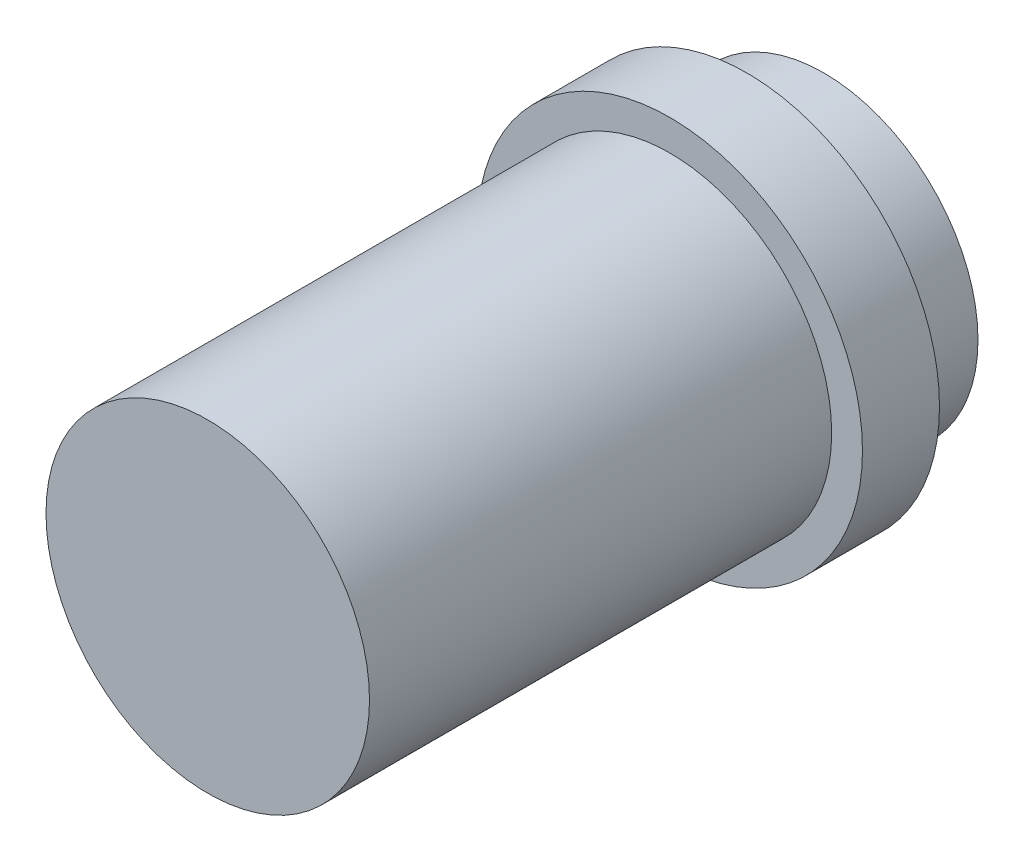
ISO-10303-21;
HEADER;
FILE_DESCRIPTION(('STEP AP214'),'2;1');
FILE_NAME('part.step','',(''),(''),'','','');
FILE_SCHEMA(('AUTOMOTIVE_DESIGN { 1 0 10303 214 1 1 1 1 }'));
ENDSEC;
DATA;
#1=APPLICATION_CONTEXT('core data for automotive mechanical design processes');
#2=APPLICATION_PROTOCOL_DEFINITION('international standard','automotive_design',2000,#1);
#3=PRODUCT_CONTEXT('',#1,'mechanical');
#4=PRODUCT('Part','Part','',(#3));
#5=PRODUCT_RELATED_PRODUCT_CATEGORY('part','',(#4));
#6=PRODUCT_DEFINITION_FORMATION('','',#4);
#7=PRODUCT_DEFINITION_CONTEXT('part definition',#1,'design');
#8=PRODUCT_DEFINITION('design','',#6,#7);
#9=PRODUCT_DEFINITION_SHAPE('','',#8);
#10=(LENGTH_UNIT() NAMED_UNIT(*) SI_UNIT(.MILLI.,.METRE.));
#11=(NAMED_UNIT(*) PLANE_ANGLE_UNIT() SI_UNIT($,.RADIAN.));
#12=(NAMED_UNIT(*) SI_UNIT($,.STERADIAN.) SOLID_ANGLE_UNIT());
#13=UNCERTAINTY_MEASURE_WITH_UNIT(LENGTH_MEASURE(1.E-05),#10,'distance_accuracy_value','');
#14=(GEOMETRIC_REPRESENTATION_CONTEXT(3) GLOBAL_UNCERTAINTY_ASSIGNED_CONTEXT((#13)) GLOBAL_UNIT_ASSIGNED_CONTEXT((#10,
#11,#12)) REPRESENTATION_CONTEXT('',''));
#15=CARTESIAN_POINT('',(0.,0.,0.));
#16=DIRECTION('',(0.,0.,1.));
#17=DIRECTION('',(1.,0.,0.));
#18=AXIS2_PLACEMENT_3D('',#15,#16,#17);
#19=CARTESIAN_POINT('',(0.,0.,1.));
#20=DIRECTION('',(0.,0.,-1.));
#21=DIRECTION('',(-1.,0.,0.));
#22=AXIS2_PLACEMENT_3D('',#19,#20,#21);
#23=CYLINDRICAL_SURFACE('',#22,1.25);
#24=CARTESIAN_POINT('',(0.,0.,-1.));
#25=DIRECTION('',(0.,0.,-1.));
#26=DIRECTION('',(-1.,0.,0.));
#27=AXIS2_PLACEMENT_3D('',#24,#25,#26);
#28=CIRCLE('',#27,1.25);
#29=CARTESIAN_POINT('',(-1.25,0.,-1.));
#30=VERTEX_POINT('',#29);
#31=EDGE_CURVE('E53',#30,#30,#28,.T.);
#32=ORIENTED_EDGE('',*,*,#31,.T.);
#33=EDGE_LOOP('',(#32));
#34=FACE_BOUND('',#33,.T.);
#35=CARTESIAN_POINT('',(0.,0.,6.));
#36=DIRECTION('',(0.,0.,1.));
#37=DIRECTION('',(1.,0.,0.));
#38=AXIS2_PLACEMENT_3D('',#35,#36,#37);
#39=CIRCLE('',#38,1.25);
#40=CARTESIAN_POINT('',(1.25,0.,6.));
#41=VERTEX_POINT('',#40);
#42=EDGE_CURVE('E60',#41,#41,#39,.T.);
#43=ORIENTED_EDGE('',*,*,#42,.T.);
#44=EDGE_LOOP('',(#43));
#45=FACE_BOUND('',#44,.T.);
#46=ADVANCED_FACE('F33',(#34,#45),#23,.F.);
#47=CARTESIAN_POINT('',(0.,0.,1.));
#48=DIRECTION('',(0.,0.,1.));
#49=DIRECTION('',(1.,0.,0.));
#50=AXIS2_PLACEMENT_3D('',#47,#48,#49);
#51=PLANE('',#50);
#52=CARTESIAN_POINT('',(0.,0.,1.));
#53=DIRECTION('',(0.,0.,1.));
#54=DIRECTION('',(1.,0.,0.));
#55=AXIS2_PLACEMENT_3D('',#52,#53,#54);
#56=CIRCLE('',#55,2.5);
#57=CARTESIAN_POINT('',(2.5,0.,1.));
#58=VERTEX_POINT('',#57);
#59=EDGE_CURVE('E40',#58,#58,#56,.T.);
#60=ORIENTED_EDGE('',*,*,#59,.T.);
#61=EDGE_LOOP('',(#60));
#62=FACE_BOUND('',#61,.T.);
#63=CARTESIAN_POINT('',(0.,0.,1.));
#64=DIRECTION('',(0.,0.,1.));
#65=DIRECTION('',(1.,0.,0.));
#66=AXIS2_PLACEMENT_3D('',#63,#64,#65);
#67=CIRCLE('',#66,2.1);
#68=CARTESIAN_POINT('',(2.1,0.,1.));
#69=VERTEX_POINT('',#68);
#70=EDGE_CURVE('E57',#69,#69,#67,.T.);
#71=ORIENTED_EDGE('',*,*,#70,.F.);
#72=EDGE_LOOP('',(#71));
#73=FACE_BOUND('',#72,.T.);
#74=ADVANCED_FACE('F79',(#62,#73),#51,.T.);
#75=CARTESIAN_POINT('',(0.,0.,0.));
#76=DIRECTION('',(0.,0.,1.));
#77=DIRECTION('',(1.,0.,0.));
#78=AXIS2_PLACEMENT_3D('',#75,#76,#77);
#79=PLANE('',#78);
#80=CARTESIAN_POINT('',(0.,0.,0.));
#81=DIRECTION('',(0.,0.,1.));
#82=DIRECTION('',(1.,0.,0.));
#83=AXIS2_PLACEMENT_3D('',#80,#81,#82);
#84=CIRCLE('',#83,2.5);
#85=CARTESIAN_POINT('',(2.5,0.,0.));
#86=VERTEX_POINT('',#85);
#87=EDGE_CURVE('E44',#86,#86,#84,.T.);
#88=ORIENTED_EDGE('',*,*,#87,.F.);
#89=EDGE_LOOP('',(#88));
#90=FACE_BOUND('',#89,.T.);
#91=CARTESIAN_POINT('',(0.,0.,0.));
#92=DIRECTION('',(0.,0.,1.));
#93=DIRECTION('',(1.,0.,0.));
#94=AXIS2_PLACEMENT_3D('',#91,#92,#93);
#95=CIRCLE('',#94,2.);
#96=CARTESIAN_POINT('',(2.,0.,0.));
#97=VERTEX_POINT('',#96);
#98=EDGE_CURVE('E10',#97,#97,#95,.F.);
#99=ORIENTED_EDGE('',*,*,#98,.F.);
#100=EDGE_LOOP('',(#99));
#101=FACE_BOUND('',#100,.T.);
#102=ADVANCED_FACE('F85',(#90,#101),#79,.F.);
#103=CARTESIAN_POINT('',(0.,0.,1.));
#104=DIRECTION('',(0.,0.,-1.));
#105=DIRECTION('',(-1.,0.,0.));
#106=AXIS2_PLACEMENT_3D('',#103,#104,#105);
#107=CYLINDRICAL_SURFACE('',#106,2.5);
#108=ORIENTED_EDGE('',*,*,#59,.F.);
#109=EDGE_LOOP('',(#108));
#110=FACE_BOUND('',#109,.T.);
#111=ORIENTED_EDGE('',*,*,#87,.T.);
#112=EDGE_LOOP('',(#111));
#113=FACE_BOUND('',#112,.T.);
#114=ADVANCED_FACE('F35',(#110,#113),#107,.T.);
#115=CARTESIAN_POINT('',(0.,0.,-1.));
#116=DIRECTION('',(0.,0.,-1.));
#117=DIRECTION('',(-1.,0.,0.));
#118=AXIS2_PLACEMENT_3D('',#115,#116,#117);
#119=PLANE('',#118);
#120=CARTESIAN_POINT('',(0.,0.,-1.));
#121=DIRECTION('',(0.,0.,-1.));
#122=DIRECTION('',(-1.,0.,0.));
#123=AXIS2_PLACEMENT_3D('',#120,#121,#122);
#124=CIRCLE('',#123,2.);
#125=CARTESIAN_POINT('',(-2.,0.,-1.));
#126=VERTEX_POINT('',#125);
#127=EDGE_CURVE('E49',#126,#126,#124,.T.);
#128=ORIENTED_EDGE('',*,*,#127,.T.);
#129=EDGE_LOOP('',(#128));
#130=FACE_BOUND('',#129,.T.);
#131=ORIENTED_EDGE('',*,*,#31,.F.);
#132=EDGE_LOOP('',(#131));
#133=FACE_BOUND('',#132,.T.);
#134=ADVANCED_FACE('F95',(#130,#133),#119,.T.);
#135=CARTESIAN_POINT('',(0.,0.,-1.));
#136=DIRECTION('',(0.,0.,1.));
#137=DIRECTION('',(1.,0.,0.));
#138=AXIS2_PLACEMENT_3D('',#135,#136,#137);
#139=CYLINDRICAL_SURFACE('',#138,2.);
#140=ORIENTED_EDGE('',*,*,#127,.F.);
#141=EDGE_LOOP('',(#140));
#142=FACE_BOUND('',#141,.T.);
#143=ORIENTED_EDGE('',*,*,#98,.T.);
#144=EDGE_LOOP('',(#143));
#145=FACE_BOUND('',#144,.T.);
#146=ADVANCED_FACE('F88',(#142,#145),#139,.T.);
#147=CARTESIAN_POINT('',(0.,0.,7.));
#148=DIRECTION('',(0.,0.,1.));
#149=DIRECTION('',(1.,0.,0.));
#150=AXIS2_PLACEMENT_3D('',#147,#148,#149);
#151=PLANE('',#150);
#152=CARTESIAN_POINT('',(0.,0.,7.));
#153=DIRECTION('',(0.,0.,1.));
#154=DIRECTION('',(1.,0.,0.));
#155=AXIS2_PLACEMENT_3D('',#152,#153,#154);
#156=CIRCLE('',#155,2.1);
#157=CARTESIAN_POINT('',(2.1,0.,7.));
#158=VERTEX_POINT('',#157);
#159=EDGE_CURVE('E56',#158,#158,#156,.T.);
#160=ORIENTED_EDGE('',*,*,#159,.T.);
#161=EDGE_LOOP('',(#160));
#162=FACE_BOUND('',#161,.T.);
#163=ADVANCED_FACE('F74',(#162),#151,.T.);
#164=CARTESIAN_POINT('',(0.,0.,7.));
#165=DIRECTION('',(0.,0.,-1.));
#166=DIRECTION('',(-1.,0.,0.));
#167=AXIS2_PLACEMENT_3D('',#164,#165,#166);
#168=CYLINDRICAL_SURFACE('',#167,2.1);
#169=ORIENTED_EDGE('',*,*,#159,.F.);
#170=EDGE_LOOP('',(#169));
#171=FACE_BOUND('',#170,.T.);
#172=ORIENTED_EDGE('',*,*,#70,.T.);
#173=EDGE_LOOP('',(#172));
#174=FACE_BOUND('',#173,.T.);
#175=ADVANCED_FACE('F69',(#171,#174),#168,.T.);
#176=CARTESIAN_POINT('',(0.,0.,6.));
#177=DIRECTION('',(0.,0.,1.));
#178=DIRECTION('',(1.,0.,0.));
#179=AXIS2_PLACEMENT_3D('',#176,#177,#178);
#180=PLANE('',#179);
#181=ORIENTED_EDGE('',*,*,#42,.F.);
#182=EDGE_LOOP('',(#181));
#183=FACE_BOUND('',#182,.T.);
#184=ADVANCED_FACE('F67',(#183),#180,.F.);
#185=CLOSED_SHELL('',(#46,#74,#102,#114,#134,#146,#163,#175,#184));
#186=MANIFOLD_SOLID_BREP('B2',#185);
#187=ADVANCED_BREP_SHAPE_REPRESENTATION('',(#18,#186),#14);
#188=SHAPE_DEFINITION_REPRESENTATION(#9,#187);
ENDSEC;
END-ISO-10303-21;
